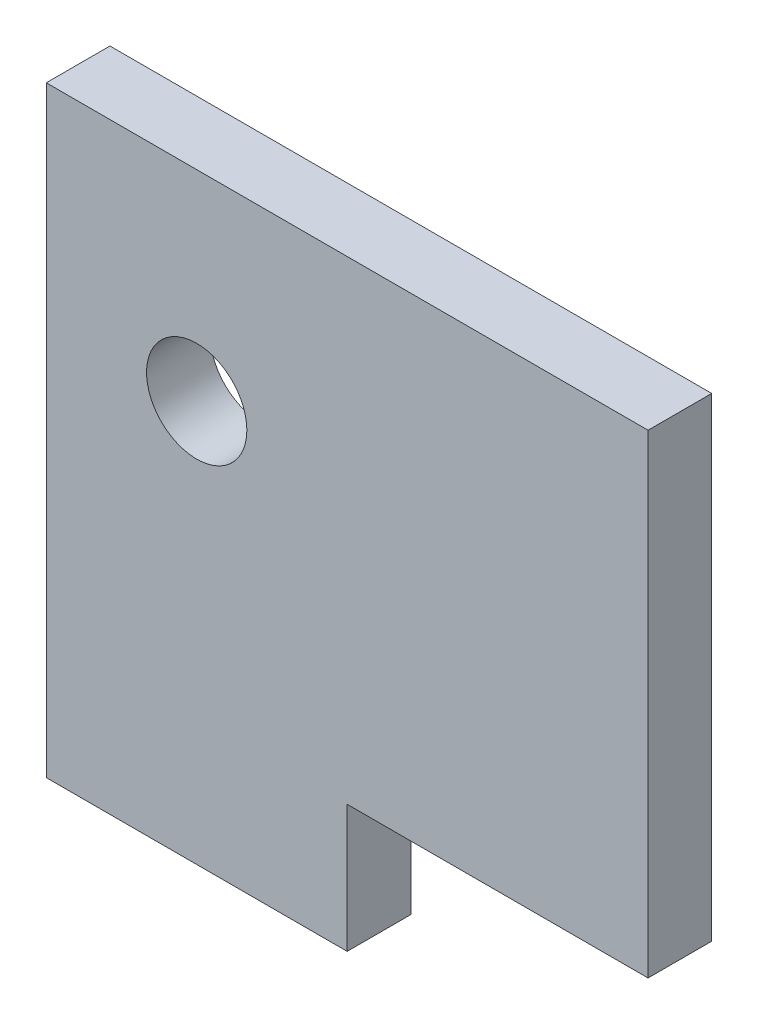
ISO-10303-21;
HEADER;
FILE_DESCRIPTION(('STEP AP214'),'2;1');
FILE_NAME('part.step','',(''),(''),'','','');
FILE_SCHEMA(('AUTOMOTIVE_DESIGN { 1 0 10303 214 1 1 1 1 }'));
ENDSEC;
DATA;
#1=APPLICATION_CONTEXT('core data for automotive mechanical design processes');
#2=APPLICATION_PROTOCOL_DEFINITION('international standard','automotive_design',2000,#1);
#3=PRODUCT_CONTEXT('',#1,'mechanical');
#4=PRODUCT('Part','Part','',(#3));
#5=PRODUCT_RELATED_PRODUCT_CATEGORY('part','',(#4));
#6=PRODUCT_DEFINITION_FORMATION('','',#4);
#7=PRODUCT_DEFINITION_CONTEXT('part definition',#1,'design');
#8=PRODUCT_DEFINITION('design','',#6,#7);
#9=PRODUCT_DEFINITION_SHAPE('','',#8);
#10=(LENGTH_UNIT() NAMED_UNIT(*) SI_UNIT(.MILLI.,.METRE.));
#11=(NAMED_UNIT(*) PLANE_ANGLE_UNIT() SI_UNIT($,.RADIAN.));
#12=(NAMED_UNIT(*) SI_UNIT($,.STERADIAN.) SOLID_ANGLE_UNIT());
#13=UNCERTAINTY_MEASURE_WITH_UNIT(LENGTH_MEASURE(1.E-05),#10,'distance_accuracy_value','');
#14=(GEOMETRIC_REPRESENTATION_CONTEXT(3) GLOBAL_UNCERTAINTY_ASSIGNED_CONTEXT((#13)) GLOBAL_UNIT_ASSIGNED_CONTEXT((#10,
#11,#12)) REPRESENTATION_CONTEXT('',''));
#15=CARTESIAN_POINT('',(0.,0.,0.));
#16=DIRECTION('',(0.,0.,1.));
#17=DIRECTION('',(1.,0.,0.));
#18=AXIS2_PLACEMENT_3D('',#15,#16,#17);
#19=CARTESIAN_POINT('',(0.,0.,3.175));
#20=DIRECTION('',(0.,0.,-1.));
#21=DIRECTION('',(-1.,0.,0.));
#22=AXIS2_PLACEMENT_3D('',#19,#20,#21);
#23=PLANE('',#22);
#24=DIRECTION('',(0.,-1.,0.));
#25=VECTOR('',#24,1.);
#26=CARTESIAN_POINT('',(0.,0.,3.175));
#27=LINE('',#26,#25);
#28=CARTESIAN_POINT('',(0.,30.,3.175));
#29=VERTEX_POINT('',#28);
#30=CARTESIAN_POINT('',(0.,0.,3.175));
#31=VERTEX_POINT('',#30);
#32=EDGE_CURVE('E129',#29,#31,#27,.T.);
#33=ORIENTED_EDGE('',*,*,#32,.T.);
#34=DIRECTION('',(1.,0.,0.));
#35=VECTOR('',#34,1.);
#36=CARTESIAN_POINT('',(0.,0.,3.175));
#37=LINE('',#36,#35);
#38=CARTESIAN_POINT('',(15.,0.,3.175));
#39=VERTEX_POINT('',#38);
#40=EDGE_CURVE('E87',#31,#39,#37,.T.);
#41=ORIENTED_EDGE('',*,*,#40,.T.);
#42=DIRECTION('',(0.,1.,0.));
#43=VECTOR('',#42,1.);
#44=CARTESIAN_POINT('',(15.,0.,3.175));
#45=LINE('',#44,#43);
#46=CARTESIAN_POINT('',(15.,6.35,3.175));
#47=VERTEX_POINT('',#46);
#48=EDGE_CURVE('E100',#39,#47,#45,.T.);
#49=ORIENTED_EDGE('',*,*,#48,.T.);
#50=DIRECTION('',(1.,0.,0.));
#51=VECTOR('',#50,1.);
#52=CARTESIAN_POINT('',(15.,6.35,3.175));
#53=LINE('',#52,#51);
#54=CARTESIAN_POINT('',(30.,6.35,3.175));
#55=VERTEX_POINT('',#54);
#56=EDGE_CURVE('E94',#47,#55,#53,.T.);
#57=ORIENTED_EDGE('',*,*,#56,.T.);
#58=DIRECTION('',(0.,1.,0.));
#59=VECTOR('',#58,1.);
#60=CARTESIAN_POINT('',(30.,6.35,3.175));
#61=LINE('',#60,#59);
#62=CARTESIAN_POINT('',(30.,30.,3.175));
#63=VERTEX_POINT('',#62);
#64=EDGE_CURVE('E98',#55,#63,#61,.T.);
#65=ORIENTED_EDGE('',*,*,#64,.T.);
#66=DIRECTION('',(-1.,0.,0.));
#67=VECTOR('',#66,1.);
#68=CARTESIAN_POINT('',(0.,30.,3.175));
#69=LINE('',#68,#67);
#70=EDGE_CURVE('E50',#63,#29,#69,.T.);
#71=ORIENTED_EDGE('',*,*,#70,.T.);
#72=EDGE_LOOP('',(#33,#41,#49,#57,#65,#71));
#73=FACE_BOUND('',#72,.T.);
#74=CARTESIAN_POINT('',(7.5,20.,3.175));
#75=DIRECTION('',(0.,0.,1.));
#76=DIRECTION('',(1.,0.,0.));
#77=AXIS2_PLACEMENT_3D('',#74,#75,#76);
#78=CIRCLE('',#77,2.5);
#79=CARTESIAN_POINT('',(10.,20.,3.175));
#80=VERTEX_POINT('',#79);
#81=EDGE_CURVE('E122',#80,#80,#78,.T.);
#82=ORIENTED_EDGE('',*,*,#81,.F.);
#83=EDGE_LOOP('',(#82));
#84=FACE_BOUND('',#83,.T.);
#85=ADVANCED_FACE('F33',(#73,#84),#23,.F.);
#86=CARTESIAN_POINT('',(0.,0.,0.));
#87=DIRECTION('',(0.,0.,-1.));
#88=DIRECTION('',(-1.,0.,0.));
#89=AXIS2_PLACEMENT_3D('',#86,#87,#88);
#90=PLANE('',#89);
#91=DIRECTION('',(0.,-1.,0.));
#92=VECTOR('',#91,1.);
#93=CARTESIAN_POINT('',(0.,0.,0.));
#94=LINE('',#93,#92);
#95=CARTESIAN_POINT('',(0.,30.,0.));
#96=VERTEX_POINT('',#95);
#97=CARTESIAN_POINT('',(0.,0.,0.));
#98=VERTEX_POINT('',#97);
#99=EDGE_CURVE('E118',#96,#98,#94,.T.);
#100=ORIENTED_EDGE('',*,*,#99,.F.);
#101=DIRECTION('',(-1.,0.,0.));
#102=VECTOR('',#101,1.);
#103=CARTESIAN_POINT('',(0.,30.,0.));
#104=LINE('',#103,#102);
#105=CARTESIAN_POINT('',(30.,30.,0.));
#106=VERTEX_POINT('',#105);
#107=EDGE_CURVE('E79',#106,#96,#104,.T.);
#108=ORIENTED_EDGE('',*,*,#107,.F.);
#109=DIRECTION('',(0.,1.,0.));
#110=VECTOR('',#109,1.);
#111=CARTESIAN_POINT('',(30.,6.35,0.));
#112=LINE('',#111,#110);
#113=CARTESIAN_POINT('',(30.,6.35,0.));
#114=VERTEX_POINT('',#113);
#115=EDGE_CURVE('E73',#114,#106,#112,.T.);
#116=ORIENTED_EDGE('',*,*,#115,.F.);
#117=DIRECTION('',(1.,0.,0.));
#118=VECTOR('',#117,1.);
#119=CARTESIAN_POINT('',(15.,6.35,0.));
#120=LINE('',#119,#118);
#121=CARTESIAN_POINT('',(15.,6.35,0.));
#122=VERTEX_POINT('',#121);
#123=EDGE_CURVE('E108',#122,#114,#120,.T.);
#124=ORIENTED_EDGE('',*,*,#123,.F.);
#125=DIRECTION('',(0.,1.,0.));
#126=VECTOR('',#125,1.);
#127=CARTESIAN_POINT('',(15.,0.,0.));
#128=LINE('',#127,#126);
#129=CARTESIAN_POINT('',(15.,0.,0.));
#130=VERTEX_POINT('',#129);
#131=EDGE_CURVE('E124',#130,#122,#128,.T.);
#132=ORIENTED_EDGE('',*,*,#131,.F.);
#133=DIRECTION('',(1.,0.,0.));
#134=VECTOR('',#133,1.);
#135=CARTESIAN_POINT('',(0.,0.,0.));
#136=LINE('',#135,#134);
#137=EDGE_CURVE('E121',#98,#130,#136,.T.);
#138=ORIENTED_EDGE('',*,*,#137,.F.);
#139=EDGE_LOOP('',(#100,#108,#116,#124,#132,#138));
#140=FACE_BOUND('',#139,.T.);
#141=CARTESIAN_POINT('',(7.5,20.,0.));
#142=DIRECTION('',(0.,0.,1.));
#143=DIRECTION('',(1.,0.,0.));
#144=AXIS2_PLACEMENT_3D('',#141,#142,#143);
#145=CIRCLE('',#144,2.5);
#146=CARTESIAN_POINT('',(10.,20.,0.));
#147=VERTEX_POINT('',#146);
#148=EDGE_CURVE('E222',#147,#147,#145,.T.);
#149=ORIENTED_EDGE('',*,*,#148,.T.);
#150=EDGE_LOOP('',(#149));
#151=FACE_BOUND('',#150,.T.);
#152=ADVANCED_FACE('F138',(#140,#151),#90,.T.);
#153=CARTESIAN_POINT('',(0.,0.,3.175));
#154=DIRECTION('',(1.,0.,0.));
#155=DIRECTION('',(0.,0.,-1.));
#156=AXIS2_PLACEMENT_3D('',#153,#154,#155);
#157=PLANE('',#156);
#158=ORIENTED_EDGE('',*,*,#99,.T.);
#159=DIRECTION('',(0.,0.,-1.));
#160=VECTOR('',#159,1.);
#161=CARTESIAN_POINT('',(0.,0.,3.175));
#162=LINE('',#161,#160);
#163=EDGE_CURVE('E11',#31,#98,#162,.T.);
#164=ORIENTED_EDGE('',*,*,#163,.F.);
#165=ORIENTED_EDGE('',*,*,#32,.F.);
#166=DIRECTION('',(0.,0.,-1.));
#167=VECTOR('',#166,1.);
#168=CARTESIAN_POINT('',(0.,30.,3.175));
#169=LINE('',#168,#167);
#170=EDGE_CURVE('E114',#29,#96,#169,.T.);
#171=ORIENTED_EDGE('',*,*,#170,.T.);
#172=EDGE_LOOP('',(#158,#164,#165,#171));
#173=FACE_BOUND('',#172,.T.);
#174=ADVANCED_FACE('F35',(#173),#157,.F.);
#175=CARTESIAN_POINT('',(0.,0.,3.175));
#176=DIRECTION('',(0.,1.,0.));
#177=DIRECTION('',(0.,0.,1.));
#178=AXIS2_PLACEMENT_3D('',#175,#176,#177);
#179=PLANE('',#178);
#180=ORIENTED_EDGE('',*,*,#137,.T.);
#181=DIRECTION('',(0.,0.,-1.));
#182=VECTOR('',#181,1.);
#183=CARTESIAN_POINT('',(15.,0.,3.175));
#184=LINE('',#183,#182);
#185=EDGE_CURVE('E42',#39,#130,#184,.T.);
#186=ORIENTED_EDGE('',*,*,#185,.F.);
#187=ORIENTED_EDGE('',*,*,#40,.F.);
#188=ORIENTED_EDGE('',*,*,#163,.T.);
#189=EDGE_LOOP('',(#180,#186,#187,#188));
#190=FACE_BOUND('',#189,.T.);
#191=ADVANCED_FACE('F163',(#190),#179,.F.);
#192=CARTESIAN_POINT('',(15.,0.,3.175));
#193=DIRECTION('',(-1.,0.,0.));
#194=DIRECTION('',(0.,0.,1.));
#195=AXIS2_PLACEMENT_3D('',#192,#193,#194);
#196=PLANE('',#195);
#197=ORIENTED_EDGE('',*,*,#131,.T.);
#198=DIRECTION('',(0.,0.,-1.));
#199=VECTOR('',#198,1.);
#200=CARTESIAN_POINT('',(15.,6.35,3.175));
#201=LINE('',#200,#199);
#202=EDGE_CURVE('E109',#47,#122,#201,.T.);
#203=ORIENTED_EDGE('',*,*,#202,.F.);
#204=ORIENTED_EDGE('',*,*,#48,.F.);
#205=ORIENTED_EDGE('',*,*,#185,.T.);
#206=EDGE_LOOP('',(#197,#203,#204,#205));
#207=FACE_BOUND('',#206,.T.);
#208=ADVANCED_FACE('F135',(#207),#196,.F.);
#209=CARTESIAN_POINT('',(15.,6.35,3.175));
#210=DIRECTION('',(0.,1.,0.));
#211=DIRECTION('',(-1.,0.,0.));
#212=AXIS2_PLACEMENT_3D('',#209,#210,#211);
#213=PLANE('',#212);
#214=ORIENTED_EDGE('',*,*,#123,.T.);
#215=DIRECTION('',(0.,0.,-1.));
#216=VECTOR('',#215,1.);
#217=CARTESIAN_POINT('',(30.,6.35,3.175));
#218=LINE('',#217,#216);
#219=EDGE_CURVE('E105',#55,#114,#218,.T.);
#220=ORIENTED_EDGE('',*,*,#219,.F.);
#221=ORIENTED_EDGE('',*,*,#56,.F.);
#222=ORIENTED_EDGE('',*,*,#202,.T.);
#223=EDGE_LOOP('',(#214,#220,#221,#222));
#224=FACE_BOUND('',#223,.T.);
#225=ADVANCED_FACE('F106',(#224),#213,.F.);
#226=CARTESIAN_POINT('',(30.,6.35,3.175));
#227=DIRECTION('',(-1.,0.,0.));
#228=DIRECTION('',(0.,-1.,0.));
#229=AXIS2_PLACEMENT_3D('',#226,#227,#228);
#230=PLANE('',#229);
#231=ORIENTED_EDGE('',*,*,#115,.T.);
#232=DIRECTION('',(0.,0.,-1.));
#233=VECTOR('',#232,1.);
#234=CARTESIAN_POINT('',(30.,30.,3.175));
#235=LINE('',#234,#233);
#236=EDGE_CURVE('E110',#63,#106,#235,.T.);
#237=ORIENTED_EDGE('',*,*,#236,.F.);
#238=ORIENTED_EDGE('',*,*,#64,.F.);
#239=ORIENTED_EDGE('',*,*,#219,.T.);
#240=EDGE_LOOP('',(#231,#237,#238,#239));
#241=FACE_BOUND('',#240,.T.);
#242=ADVANCED_FACE('F112',(#241),#230,.F.);
#243=CARTESIAN_POINT('',(0.,30.,3.175));
#244=DIRECTION('',(0.,-1.,0.));
#245=DIRECTION('',(0.,0.,-1.));
#246=AXIS2_PLACEMENT_3D('',#243,#244,#245);
#247=PLANE('',#246);
#248=ORIENTED_EDGE('',*,*,#107,.T.);
#249=ORIENTED_EDGE('',*,*,#170,.F.);
#250=ORIENTED_EDGE('',*,*,#70,.F.);
#251=ORIENTED_EDGE('',*,*,#236,.T.);
#252=EDGE_LOOP('',(#248,#249,#250,#251));
#253=FACE_BOUND('',#252,.T.);
#254=ADVANCED_FACE('F143',(#253),#247,.F.);
#255=CARTESIAN_POINT('',(7.5,20.,3.175));
#256=DIRECTION('',(0.,0.,-1.));
#257=DIRECTION('',(-1.,0.,0.));
#258=AXIS2_PLACEMENT_3D('',#255,#256,#257);
#259=CYLINDRICAL_SURFACE('',#258,2.5);
#260=ORIENTED_EDGE('',*,*,#81,.T.);
#261=EDGE_LOOP('',(#260));
#262=FACE_BOUND('',#261,.T.);
#263=ORIENTED_EDGE('',*,*,#148,.F.);
#264=EDGE_LOOP('',(#263));
#265=FACE_BOUND('',#264,.T.);
#266=ADVANCED_FACE('F145',(#262,#265),#259,.F.);
#267=CLOSED_SHELL('',(#85,#152,#174,#191,#208,#225,#242,#254,#266));
#268=MANIFOLD_SOLID_BREP('B2',#267);
#269=ADVANCED_BREP_SHAPE_REPRESENTATION('',(#18,#268),#14);
#270=SHAPE_DEFINITION_REPRESENTATION(#9,#269);
ENDSEC;
END-ISO-10303-21;
